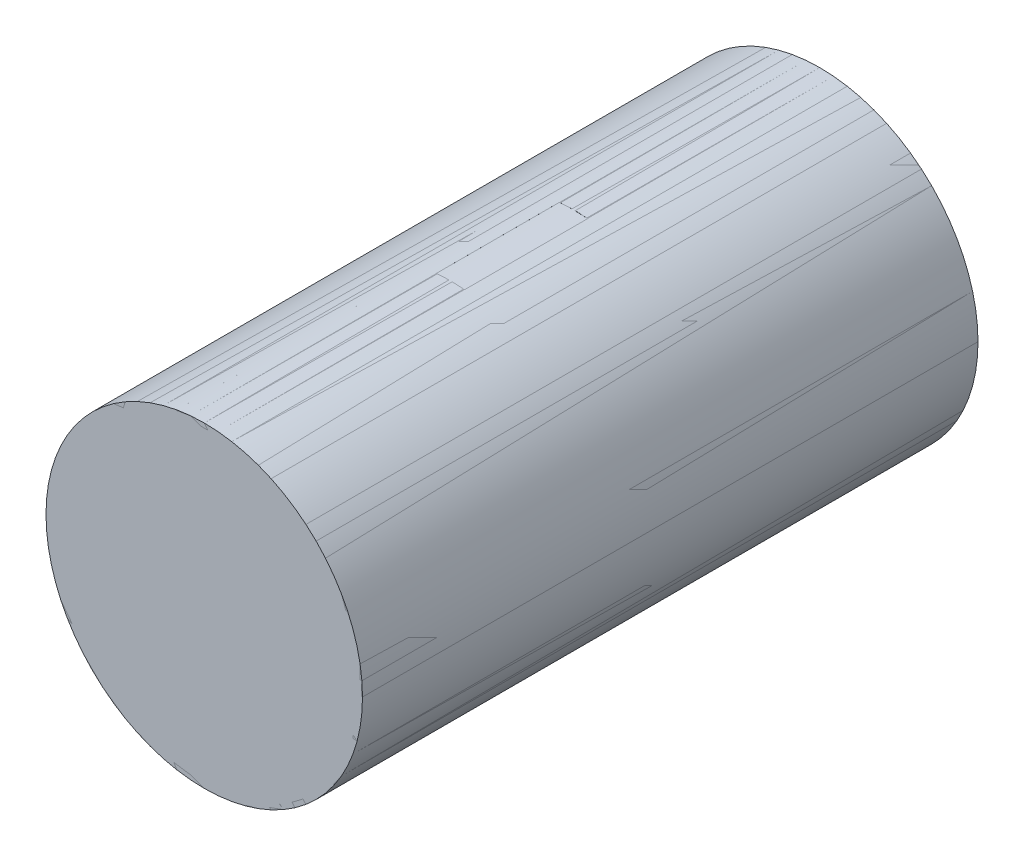
ISO-10303-21;
HEADER;
FILE_DESCRIPTION(('STEP AP214'),'2;1');
FILE_NAME('part.step','',(''),(''),'','','');
FILE_SCHEMA(('AUTOMOTIVE_DESIGN { 1 0 10303 214 1 1 1 1 }'));
ENDSEC;
DATA;
#1=APPLICATION_CONTEXT('core data for automotive mechanical design processes');
#2=APPLICATION_PROTOCOL_DEFINITION('international standard','automotive_design',2000,#1);
#3=PRODUCT_CONTEXT('',#1,'mechanical');
#4=PRODUCT('Part','Part','',(#3));
#5=PRODUCT_RELATED_PRODUCT_CATEGORY('part','',(#4));
#6=PRODUCT_DEFINITION_FORMATION('','',#4);
#7=PRODUCT_DEFINITION_CONTEXT('part definition',#1,'design');
#8=PRODUCT_DEFINITION('design','',#6,#7);
#9=PRODUCT_DEFINITION_SHAPE('','',#8);
#10=(LENGTH_UNIT() NAMED_UNIT(*) SI_UNIT(.MILLI.,.METRE.));
#11=(NAMED_UNIT(*) PLANE_ANGLE_UNIT() SI_UNIT($,.RADIAN.));
#12=(NAMED_UNIT(*) SI_UNIT($,.STERADIAN.) SOLID_ANGLE_UNIT());
#13=UNCERTAINTY_MEASURE_WITH_UNIT(LENGTH_MEASURE(1.E-05),#10,'distance_accuracy_value','');
#14=(GEOMETRIC_REPRESENTATION_CONTEXT(3) GLOBAL_UNCERTAINTY_ASSIGNED_CONTEXT((#13)) GLOBAL_UNIT_ASSIGNED_CONTEXT((#10,
#11,#12)) REPRESENTATION_CONTEXT('',''));
#15=CARTESIAN_POINT('',(0.,0.,0.));
#16=DIRECTION('',(0.,0.,1.));
#17=DIRECTION('',(1.,0.,0.));
#18=AXIS2_PLACEMENT_3D('',#15,#16,#17);
#19=CARTESIAN_POINT('',(0.,0.,0.));
#20=DIRECTION('',(0.,0.,1.));
#21=DIRECTION('',(1.,0.,0.));
#22=AXIS2_PLACEMENT_3D('',#19,#20,#21);
#23=CYLINDRICAL_SURFACE('',#22,78.359);
#24=CARTESIAN_POINT('',(0.,0.,0.));
#25=DIRECTION('',(0.,0.,1.));
#26=DIRECTION('',(1.,0.,0.));
#27=AXIS2_PLACEMENT_3D('',#24,#25,#26);
#28=CIRCLE('',#27,78.359);
#29=CARTESIAN_POINT('',(78.359,0.,0.));
#30=VERTEX_POINT('',#29);
#31=EDGE_CURVE('E11',#30,#30,#28,.T.);
#32=CARTESIAN_POINT('',(0.,0.,304.8));
#33=DIRECTION('',(0.,0.,1.));
#34=DIRECTION('',(1.,0.,0.));
#35=AXIS2_PLACEMENT_3D('',#32,#33,#34);
#36=CIRCLE('',#35,78.359);
#37=CARTESIAN_POINT('',(78.359,0.,304.8));
#38=VERTEX_POINT('',#37);
#39=EDGE_CURVE('E50',#38,#38,#36,.T.);
#40=CARTESIAN_POINT('',(78.359,0.,0.));
#41=CARTESIAN_POINT('',(78.359,0.,3.175));
#42=CARTESIAN_POINT('',(78.359,0.,6.35));
#43=CARTESIAN_POINT('',(78.359,0.,12.7));
#44=CARTESIAN_POINT('',(78.359,0.,15.875));
#45=CARTESIAN_POINT('',(78.359,0.,22.225));
#46=CARTESIAN_POINT('',(78.359,0.,25.4));
#47=CARTESIAN_POINT('',(78.359,0.,31.75));
#48=CARTESIAN_POINT('',(78.359,0.,34.925));
#49=CARTESIAN_POINT('',(78.359,0.,41.275));
#50=CARTESIAN_POINT('',(78.359,0.,44.45));
#51=CARTESIAN_POINT('',(78.359,0.,50.8));
#52=CARTESIAN_POINT('',(78.359,0.,53.975));
#53=CARTESIAN_POINT('',(78.359,0.,60.325));
#54=CARTESIAN_POINT('',(78.359,0.,63.5));
#55=CARTESIAN_POINT('',(78.359,0.,69.85));
#56=CARTESIAN_POINT('',(78.359,0.,73.025));
#57=CARTESIAN_POINT('',(78.359,0.,79.375));
#58=CARTESIAN_POINT('',(78.359,0.,82.55));
#59=CARTESIAN_POINT('',(78.359,0.,88.9));
#60=CARTESIAN_POINT('',(78.359,0.,92.075));
#61=CARTESIAN_POINT('',(78.359,0.,98.425));
#62=CARTESIAN_POINT('',(78.359,0.,101.6));
#63=CARTESIAN_POINT('',(78.359,0.,107.95));
#64=CARTESIAN_POINT('',(78.359,0.,111.125));
#65=CARTESIAN_POINT('',(78.359,0.,117.475));
#66=CARTESIAN_POINT('',(78.359,0.,120.65));
#67=CARTESIAN_POINT('',(78.359,0.,127.));
#68=CARTESIAN_POINT('',(78.359,0.,130.175));
#69=CARTESIAN_POINT('',(78.359,0.,136.525));
#70=CARTESIAN_POINT('',(78.359,0.,139.7));
#71=CARTESIAN_POINT('',(78.359,0.,146.05));
#72=CARTESIAN_POINT('',(78.359,0.,149.225));
#73=CARTESIAN_POINT('',(78.359,0.,155.575));
#74=CARTESIAN_POINT('',(78.359,0.,158.75));
#75=CARTESIAN_POINT('',(78.359,0.,165.1));
#76=CARTESIAN_POINT('',(78.359,0.,168.275));
#77=CARTESIAN_POINT('',(78.359,0.,174.625));
#78=CARTESIAN_POINT('',(78.359,0.,177.8));
#79=CARTESIAN_POINT('',(78.359,0.,184.15));
#80=CARTESIAN_POINT('',(78.359,0.,187.325));
#81=CARTESIAN_POINT('',(78.359,0.,193.675));
#82=CARTESIAN_POINT('',(78.359,0.,196.85));
#83=CARTESIAN_POINT('',(78.359,0.,203.2));
#84=CARTESIAN_POINT('',(78.359,0.,206.375));
#85=CARTESIAN_POINT('',(78.359,0.,212.725));
#86=CARTESIAN_POINT('',(78.359,0.,215.9));
#87=CARTESIAN_POINT('',(78.359,0.,222.25));
#88=CARTESIAN_POINT('',(78.359,0.,225.425));
#89=CARTESIAN_POINT('',(78.359,0.,231.775));
#90=CARTESIAN_POINT('',(78.359,0.,234.95));
#91=CARTESIAN_POINT('',(78.359,0.,241.3));
#92=CARTESIAN_POINT('',(78.359,0.,244.475));
#93=CARTESIAN_POINT('',(78.359,0.,250.825));
#94=CARTESIAN_POINT('',(78.359,0.,254.));
#95=CARTESIAN_POINT('',(78.359,0.,260.35));
#96=CARTESIAN_POINT('',(78.359,0.,263.525));
#97=CARTESIAN_POINT('',(78.359,0.,269.875));
#98=CARTESIAN_POINT('',(78.359,0.,273.05));
#99=CARTESIAN_POINT('',(78.359,0.,279.4));
#100=CARTESIAN_POINT('',(78.359,0.,282.575));
#101=CARTESIAN_POINT('',(78.359,0.,288.925));
#102=CARTESIAN_POINT('',(78.359,0.,292.1));
#103=CARTESIAN_POINT('',(78.359,0.,298.45));
#104=CARTESIAN_POINT('',(78.359,0.,301.625));
#105=CARTESIAN_POINT('',(78.359,0.,304.8));
#106=B_SPLINE_CURVE_WITH_KNOTS('',3,(#40,#41,#42,#43,#44,#45,#46,#47,#48,#49,#50,#51,#52,#53,
#54,#55,#56,#57,#58,#59,#60,#61,#62,#63,#64,#65,#66,#67,#68,#69,#70,#71,#72,#73,#74,#75,#76,#77,
#78,#79,#80,#81,#82,#83,#84,#85,#86,#87,#88,#89,#90,#91,#92,#93,#94,#95,#96,#97,#98,#99,#100,
#101,#102,#103,#104,#105),.UNSPECIFIED.,.F.,.F.,(4,2,2,2,2,2,2,2,2,2,2,2,2,2,2,2,2,2,2,2,2,2,2,
2,2,2,2,2,2,2,2,2,4),(0.,9.525,19.05,28.575,38.1,47.625,57.15,66.675,76.2,85.725,95.25,104.775,
114.3,123.825,133.35,142.875,152.4,161.925,171.45,180.975,190.5,200.025,209.55,219.075,228.6,
238.125,247.65,257.175,266.7,276.225,285.75,295.275,304.8),.UNSPECIFIED.);
#107=EDGE_CURVE('BSEAM47',#30,#38,#106,.T.);
#108=ORIENTED_EDGE('',*,*,#31,.T.);
#109=ORIENTED_EDGE('',*,*,#39,.F.);
#110=ORIENTED_EDGE('',*,*,#107,.T.);
#111=ORIENTED_EDGE('',*,*,#107,.F.);
#112=EDGE_LOOP('',(#108,#110,#109,#111));
#113=FACE_BOUND('',#112,.T.);
#114=ADVANCED_FACE('F47',(#113),#23,.T.);
#115=CARTESIAN_POINT('',(0.,0.,0.));
#116=DIRECTION('',(0.,0.,1.));
#117=DIRECTION('',(1.,0.,0.));
#118=AXIS2_PLACEMENT_3D('',#115,#116,#117);
#119=PLANE('',#118);
#120=ORIENTED_EDGE('',*,*,#31,.F.);
#121=EDGE_LOOP('',(#120));
#122=FACE_BOUND('',#121,.T.);
#123=ADVANCED_FACE('F62',(#122),#119,.F.);
#124=CARTESIAN_POINT('',(0.,0.,304.8));
#125=DIRECTION('',(0.,0.,1.));
#126=DIRECTION('',(1.,0.,0.));
#127=AXIS2_PLACEMENT_3D('',#124,#125,#126);
#128=PLANE('',#127);
#129=ORIENTED_EDGE('',*,*,#39,.T.);
#130=EDGE_LOOP('',(#129));
#131=FACE_BOUND('',#130,.T.);
#132=ADVANCED_FACE('F59',(#131),#128,.T.);
#133=CLOSED_SHELL('',(#114,#123,#132));
#134=MANIFOLD_SOLID_BREP('B2',#133);
#135=CARTESIAN_POINT('',(0.,0.,304.8));
#136=DIRECTION('',(0.,0.,-1.));
#137=DIRECTION('',(-1.,0.,0.));
#138=AXIS2_PLACEMENT_3D('',#135,#136,#137);
#139=CYLINDRICAL_SURFACE('',#138,78.359);
#140=CARTESIAN_POINT('',(0.,0.,304.8));
#141=DIRECTION('',(0.,0.,1.));
#142=DIRECTION('',(1.,0.,0.));
#143=AXIS2_PLACEMENT_3D('',#140,#141,#142);
#144=CIRCLE('',#143,78.359);
#145=CARTESIAN_POINT('',(78.359,0.,304.8));
#146=VERTEX_POINT('',#145);
#147=EDGE_CURVE('E199',#146,#146,#144,.T.);
#148=ORIENTED_EDGE('',*,*,#147,.F.);
#149=EDGE_LOOP('',(#148));
#150=FACE_BOUND('',#149,.T.);
#151=CARTESIAN_POINT('',(0.,0.,0.));
#152=DIRECTION('',(0.,0.,1.));
#153=DIRECTION('',(1.,0.,0.));
#154=AXIS2_PLACEMENT_3D('',#151,#152,#153);
#155=CIRCLE('',#154,78.359);
#156=CARTESIAN_POINT('',(78.359,0.,0.));
#157=VERTEX_POINT('',#156);
#158=EDGE_CURVE('E196',#157,#157,#155,.T.);
#159=ORIENTED_EDGE('',*,*,#158,.T.);
#160=EDGE_LOOP('',(#159));
#161=FACE_BOUND('',#160,.T.);
#162=CARTESIAN_POINT('',(0.,0.,182.88));
#163=DIRECTION('',(0.,0.,-1.));
#164=DIRECTION('',(-1.,0.,0.));
#165=AXIS2_PLACEMENT_3D('',#162,#163,#164);
#166=CIRCLE('',#165,78.359);
#167=CARTESIAN_POINT('',(6.99770000000002,-78.0459164576213,182.88));
#168=VERTEX_POINT('',#167);
#169=CARTESIAN_POINT('',(-6.99769999999998,-78.0459164576213,182.88));
#170=VERTEX_POINT('',#169);
#171=EDGE_CURVE('E178',#168,#170,#166,.T.);
#172=ORIENTED_EDGE('',*,*,#171,.F.);
#173=DIRECTION('',(0.,0.,-1.));
#174=VECTOR('',#173,1.);
#175=CARTESIAN_POINT('',(6.99770000000002,-78.0459164576213,304.8));
#176=LINE('',#175,#174);
#177=CARTESIAN_POINT('',(6.99770000000002,-78.0459164576213,121.92));
#178=VERTEX_POINT('',#177);
#179=EDGE_CURVE('E189',#178,#168,#176,.F.);
#180=ORIENTED_EDGE('',*,*,#179,.F.);
#181=CARTESIAN_POINT('',(0.,0.,121.92));
#182=DIRECTION('',(0.,0.,1.));
#183=DIRECTION('',(1.,0.,0.));
#184=AXIS2_PLACEMENT_3D('',#181,#182,#183);
#185=CIRCLE('',#184,78.359);
#186=CARTESIAN_POINT('',(-6.99769999999998,-78.0459164576213,121.92));
#187=VERTEX_POINT('',#186);
#188=EDGE_CURVE('E186',#187,#178,#185,.T.);
#189=ORIENTED_EDGE('',*,*,#188,.F.);
#190=DIRECTION('',(0.,0.,-1.));
#191=VECTOR('',#190,1.);
#192=CARTESIAN_POINT('',(-6.99769999999998,-78.0459164576213,304.8));
#193=LINE('',#192,#191);
#194=EDGE_CURVE('E168',#170,#187,#193,.T.);
#195=ORIENTED_EDGE('',*,*,#194,.F.);
#196=EDGE_LOOP('',(#172,#180,#189,#195));
#197=FACE_BOUND('',#196,.T.);
#198=CARTESIAN_POINT('',(-6.99769999999998,78.0459164576213,182.88));
#199=VERTEX_POINT('',#198);
#200=CARTESIAN_POINT('',(6.99770000000002,78.0459164576213,182.88));
#201=VERTEX_POINT('',#200);
#202=EDGE_CURVE('E169',#199,#201,#166,.T.);
#203=ORIENTED_EDGE('',*,*,#202,.F.);
#204=DIRECTION('',(0.,0.,-1.));
#205=VECTOR('',#204,1.);
#206=CARTESIAN_POINT('',(-6.99769999999998,78.0459164576213,304.8));
#207=LINE('',#206,#205);
#208=CARTESIAN_POINT('',(-6.99769999999998,78.0459164576213,121.92));
#209=VERTEX_POINT('',#208);
#210=EDGE_CURVE('E158',#209,#199,#207,.F.);
#211=ORIENTED_EDGE('',*,*,#210,.F.);
#212=CARTESIAN_POINT('',(6.99770000000002,78.0459164576213,121.92));
#213=VERTEX_POINT('',#212);
#214=EDGE_CURVE('E187',#213,#209,#185,.T.);
#215=ORIENTED_EDGE('',*,*,#214,.F.);
#216=DIRECTION('',(0.,0.,-1.));
#217=VECTOR('',#216,1.);
#218=CARTESIAN_POINT('',(6.99770000000002,78.0459164576213,304.8));
#219=LINE('',#218,#217);
#220=EDGE_CURVE('E177',#201,#213,#219,.T.);
#221=ORIENTED_EDGE('',*,*,#220,.F.);
#222=EDGE_LOOP('',(#203,#211,#215,#221));
#223=FACE_BOUND('',#222,.T.);
#224=ADVANCED_FACE('F93',(#150,#161,#197,#223),#139,.T.);
#225=CARTESIAN_POINT('',(0.,0.,304.8));
#226=DIRECTION('',(0.,0.,-1.));
#227=DIRECTION('',(-1.,0.,0.));
#228=AXIS2_PLACEMENT_3D('',#225,#226,#227);
#229=CYLINDRICAL_SURFACE('',#228,76.2);
#230=CARTESIAN_POINT('',(0.,0.,304.8));
#231=DIRECTION('',(0.,0.,1.));
#232=DIRECTION('',(1.,0.,0.));
#233=AXIS2_PLACEMENT_3D('',#230,#231,#232);
#234=CIRCLE('',#233,76.2);
#235=CARTESIAN_POINT('',(76.2,0.,304.8));
#236=VERTEX_POINT('',#235);
#237=EDGE_CURVE('E193',#236,#236,#234,.T.);
#238=ORIENTED_EDGE('',*,*,#237,.T.);
#239=EDGE_LOOP('',(#238));
#240=FACE_BOUND('',#239,.T.);
#241=CARTESIAN_POINT('',(0.,0.,0.));
#242=DIRECTION('',(0.,0.,1.));
#243=DIRECTION('',(1.,0.,0.));
#244=AXIS2_PLACEMENT_3D('',#241,#242,#243);
#245=CIRCLE('',#244,76.2);
#246=CARTESIAN_POINT('',(76.2,0.,0.));
#247=VERTEX_POINT('',#246);
#248=EDGE_CURVE('E192',#247,#247,#245,.T.);
#249=ORIENTED_EDGE('',*,*,#248,.F.);
#250=EDGE_LOOP('',(#249));
#251=FACE_BOUND('',#250,.T.);
#252=CARTESIAN_POINT('',(0.,0.,121.92));
#253=DIRECTION('',(0.,0.,1.));
#254=DIRECTION('',(1.,0.,0.));
#255=AXIS2_PLACEMENT_3D('',#252,#253,#254);
#256=CIRCLE('',#255,76.2);
#257=CARTESIAN_POINT('',(-6.99769999999998,-75.8780086369562,121.92));
#258=VERTEX_POINT('',#257);
#259=CARTESIAN_POINT('',(6.99770000000002,-75.8780086369562,121.92));
#260=VERTEX_POINT('',#259);
#261=EDGE_CURVE('E210',#258,#260,#256,.T.);
#262=ORIENTED_EDGE('',*,*,#261,.T.);
#263=DIRECTION('',(0.,0.,-1.));
#264=VECTOR('',#263,1.);
#265=CARTESIAN_POINT('',(6.99770000000002,-75.8780086369562,304.8));
#266=LINE('',#265,#264);
#267=CARTESIAN_POINT('',(6.99770000000002,-75.8780086369562,182.88));
#268=VERTEX_POINT('',#267);
#269=EDGE_CURVE('E213',#260,#268,#266,.F.);
#270=ORIENTED_EDGE('',*,*,#269,.T.);
#271=CARTESIAN_POINT('',(0.,0.,182.88));
#272=DIRECTION('',(0.,0.,-1.));
#273=DIRECTION('',(-1.,0.,0.));
#274=AXIS2_PLACEMENT_3D('',#271,#272,#273);
#275=CIRCLE('',#274,76.2);
#276=CARTESIAN_POINT('',(-6.99769999999998,-75.8780086369562,182.88));
#277=VERTEX_POINT('',#276);
#278=EDGE_CURVE('E202',#268,#277,#275,.T.);
#279=ORIENTED_EDGE('',*,*,#278,.T.);
#280=DIRECTION('',(0.,0.,-1.));
#281=VECTOR('',#280,1.);
#282=CARTESIAN_POINT('',(-6.99769999999998,-75.8780086369562,304.8));
#283=LINE('',#282,#281);
#284=EDGE_CURVE('E207',#277,#258,#283,.T.);
#285=ORIENTED_EDGE('',*,*,#284,.T.);
#286=EDGE_LOOP('',(#262,#270,#279,#285));
#287=FACE_BOUND('',#286,.T.);
#288=CARTESIAN_POINT('',(-6.99769999999998,75.8780086369562,182.88));
#289=VERTEX_POINT('',#288);
#290=CARTESIAN_POINT('',(6.99770000000002,75.8780086369562,182.88));
#291=VERTEX_POINT('',#290);
#292=EDGE_CURVE('E173',#289,#291,#275,.T.);
#293=ORIENTED_EDGE('',*,*,#292,.T.);
#294=DIRECTION('',(0.,0.,-1.));
#295=VECTOR('',#294,1.);
#296=CARTESIAN_POINT('',(6.99770000000002,75.8780086369562,304.8));
#297=LINE('',#296,#295);
#298=CARTESIAN_POINT('',(6.99770000000002,75.8780086369562,121.92));
#299=VERTEX_POINT('',#298);
#300=EDGE_CURVE('E45',#291,#299,#297,.T.);
#301=ORIENTED_EDGE('',*,*,#300,.T.);
#302=CARTESIAN_POINT('',(-6.99769999999998,75.8780086369562,121.92));
#303=VERTEX_POINT('',#302);
#304=EDGE_CURVE('E100',#299,#303,#256,.T.);
#305=ORIENTED_EDGE('',*,*,#304,.T.);
#306=DIRECTION('',(0.,0.,-1.));
#307=VECTOR('',#306,1.);
#308=CARTESIAN_POINT('',(-6.99769999999998,75.8780086369562,304.8));
#309=LINE('',#308,#307);
#310=EDGE_CURVE('E215',#303,#289,#309,.F.);
#311=ORIENTED_EDGE('',*,*,#310,.T.);
#312=EDGE_LOOP('',(#293,#301,#305,#311));
#313=FACE_BOUND('',#312,.T.);
#314=ADVANCED_FACE('F218',(#240,#251,#287,#313),#229,.F.);
#315=CARTESIAN_POINT('',(0.,0.,304.8));
#316=DIRECTION('',(0.,0.,1.));
#317=DIRECTION('',(1.,0.,0.));
#318=AXIS2_PLACEMENT_3D('',#315,#316,#317);
#319=PLANE('',#318);
#320=ORIENTED_EDGE('',*,*,#147,.T.);
#321=EDGE_LOOP('',(#320));
#322=FACE_BOUND('',#321,.T.);
#323=ORIENTED_EDGE('',*,*,#237,.F.);
#324=EDGE_LOOP('',(#323));
#325=FACE_BOUND('',#324,.T.);
#326=ADVANCED_FACE('F259',(#322,#325),#319,.T.);
#327=CARTESIAN_POINT('',(0.,0.,0.));
#328=DIRECTION('',(0.,0.,1.));
#329=DIRECTION('',(1.,0.,0.));
#330=AXIS2_PLACEMENT_3D('',#327,#328,#329);
#331=PLANE('',#330);
#332=ORIENTED_EDGE('',*,*,#158,.F.);
#333=EDGE_LOOP('',(#332));
#334=FACE_BOUND('',#333,.T.);
#335=ORIENTED_EDGE('',*,*,#248,.T.);
#336=EDGE_LOOP('',(#335));
#337=FACE_BOUND('',#336,.T.);
#338=ADVANCED_FACE('F265',(#334,#337),#331,.F.);
#339=CARTESIAN_POINT('',(-6.99769999999998,78.359,182.88));
#340=DIRECTION('',(0.,0.,-1.));
#341=DIRECTION('',(-1.,0.,0.));
#342=AXIS2_PLACEMENT_3D('',#339,#340,#341);
#343=PLANE('',#342);
#344=ORIENTED_EDGE('',*,*,#171,.T.);
#345=DIRECTION('',(0.,-1.,0.));
#346=VECTOR('',#345,1.);
#347=CARTESIAN_POINT('',(-6.99769999999998,78.359,182.88));
#348=LINE('',#347,#346);
#349=EDGE_CURVE('E115',#277,#170,#348,.T.);
#350=ORIENTED_EDGE('',*,*,#349,.F.);
#351=ORIENTED_EDGE('',*,*,#278,.F.);
#352=DIRECTION('',(0.,-1.,0.));
#353=VECTOR('',#352,1.);
#354=CARTESIAN_POINT('',(6.99770000000002,78.359,182.88));
#355=LINE('',#354,#353);
#356=EDGE_CURVE('E230',#268,#168,#355,.T.);
#357=ORIENTED_EDGE('',*,*,#356,.T.);
#358=EDGE_LOOP('',(#344,#350,#351,#357));
#359=FACE_BOUND('',#358,.T.);
#360=ADVANCED_FACE('F234',(#359),#343,.T.);
#361=CARTESIAN_POINT('',(-6.99769999999998,78.359,182.88));
#362=DIRECTION('',(1.,0.,0.));
#363=DIRECTION('',(0.,0.,-1.));
#364=AXIS2_PLACEMENT_3D('',#361,#362,#363);
#365=PLANE('',#364);
#366=ORIENTED_EDGE('',*,*,#194,.T.);
#367=DIRECTION('',(0.,-1.,0.));
#368=VECTOR('',#367,1.);
#369=CARTESIAN_POINT('',(-6.99769999999998,78.359,121.92));
#370=LINE('',#369,#368);
#371=EDGE_CURVE('E174',#258,#187,#370,.T.);
#372=ORIENTED_EDGE('',*,*,#371,.F.);
#373=ORIENTED_EDGE('',*,*,#284,.F.);
#374=ORIENTED_EDGE('',*,*,#349,.T.);
#375=EDGE_LOOP('',(#366,#372,#373,#374));
#376=FACE_BOUND('',#375,.T.);
#377=ADVANCED_FACE('F240',(#376),#365,.T.);
#378=CARTESIAN_POINT('',(-6.99769999999998,78.359,121.92));
#379=DIRECTION('',(0.,0.,1.));
#380=DIRECTION('',(1.,0.,0.));
#381=AXIS2_PLACEMENT_3D('',#378,#379,#380);
#382=PLANE('',#381);
#383=ORIENTED_EDGE('',*,*,#188,.T.);
#384=DIRECTION('',(0.,-1.,0.));
#385=VECTOR('',#384,1.);
#386=CARTESIAN_POINT('',(6.99770000000002,78.359,121.92));
#387=LINE('',#386,#385);
#388=EDGE_CURVE('E182',#260,#178,#387,.T.);
#389=ORIENTED_EDGE('',*,*,#388,.F.);
#390=ORIENTED_EDGE('',*,*,#261,.F.);
#391=ORIENTED_EDGE('',*,*,#371,.T.);
#392=EDGE_LOOP('',(#383,#389,#390,#391));
#393=FACE_BOUND('',#392,.T.);
#394=ADVANCED_FACE('F242',(#393),#382,.T.);
#395=CARTESIAN_POINT('',(6.99770000000002,78.359,182.88));
#396=DIRECTION('',(-1.,0.,0.));
#397=DIRECTION('',(0.,0.,1.));
#398=AXIS2_PLACEMENT_3D('',#395,#396,#397);
#399=PLANE('',#398);
#400=ORIENTED_EDGE('',*,*,#179,.T.);
#401=ORIENTED_EDGE('',*,*,#356,.F.);
#402=ORIENTED_EDGE('',*,*,#269,.F.);
#403=ORIENTED_EDGE('',*,*,#388,.T.);
#404=EDGE_LOOP('',(#400,#401,#402,#403));
#405=FACE_BOUND('',#404,.T.);
#406=ADVANCED_FACE('F244',(#405),#399,.T.);
#407=ORIENTED_EDGE('',*,*,#220,.T.);
#408=EDGE_CURVE('E180',#213,#299,#387,.T.);
#409=ORIENTED_EDGE('',*,*,#408,.T.);
#410=ORIENTED_EDGE('',*,*,#300,.F.);
#411=EDGE_CURVE('E107',#201,#291,#355,.T.);
#412=ORIENTED_EDGE('',*,*,#411,.F.);
#413=EDGE_LOOP('',(#407,#409,#410,#412));
#414=FACE_BOUND('',#413,.T.);
#415=ADVANCED_FACE('F221',(#414),#399,.T.);
#416=ORIENTED_EDGE('',*,*,#214,.T.);
#417=EDGE_CURVE('E164',#209,#303,#370,.T.);
#418=ORIENTED_EDGE('',*,*,#417,.T.);
#419=ORIENTED_EDGE('',*,*,#304,.F.);
#420=ORIENTED_EDGE('',*,*,#408,.F.);
#421=EDGE_LOOP('',(#416,#418,#419,#420));
#422=FACE_BOUND('',#421,.T.);
#423=ADVANCED_FACE('F251',(#422),#382,.T.);
#424=ORIENTED_EDGE('',*,*,#210,.T.);
#425=EDGE_CURVE('E161',#199,#289,#348,.T.);
#426=ORIENTED_EDGE('',*,*,#425,.T.);
#427=ORIENTED_EDGE('',*,*,#310,.F.);
#428=ORIENTED_EDGE('',*,*,#417,.F.);
#429=EDGE_LOOP('',(#424,#426,#427,#428));
#430=FACE_BOUND('',#429,.T.);
#431=ADVANCED_FACE('F160',(#430),#365,.T.);
#432=ORIENTED_EDGE('',*,*,#202,.T.);
#433=ORIENTED_EDGE('',*,*,#411,.T.);
#434=ORIENTED_EDGE('',*,*,#292,.F.);
#435=ORIENTED_EDGE('',*,*,#425,.F.);
#436=EDGE_LOOP('',(#432,#433,#434,#435));
#437=FACE_BOUND('',#436,.T.);
#438=ADVANCED_FACE('F171',(#437),#343,.T.);
#439=CLOSED_SHELL('',(#224,#314,#326,#338,#360,#377,#394,#406,#415,#423,#431,#438));
#440=MANIFOLD_SOLID_BREP('B6',#439);
#441=ADVANCED_BREP_SHAPE_REPRESENTATION('',(#18,#134,#440),#14);
#442=SHAPE_DEFINITION_REPRESENTATION(#9,#441);
ENDSEC;
END-ISO-10303-21;
